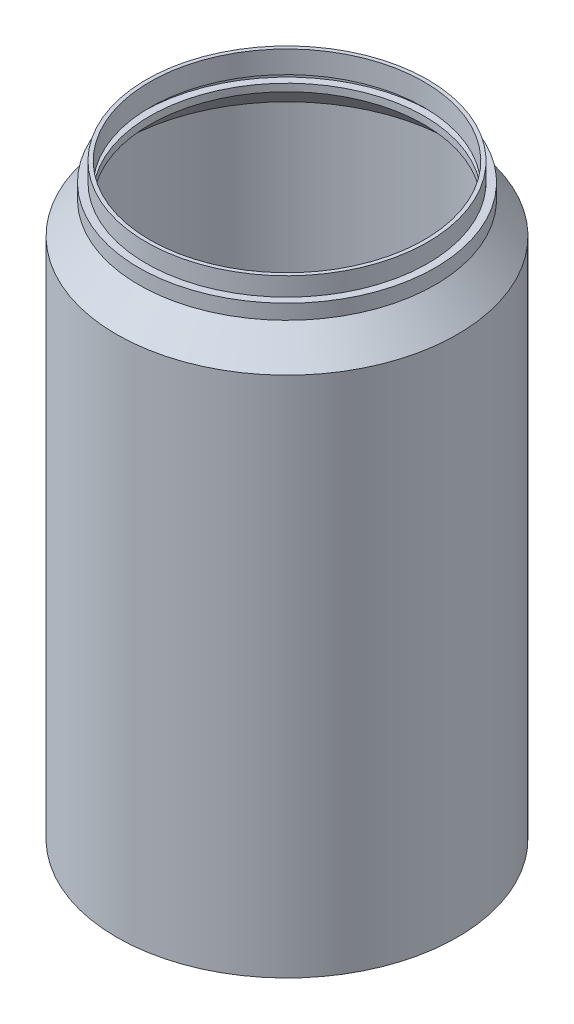
ISO-10303-21;
HEADER;
FILE_DESCRIPTION(('STEP AP214'),'2;1');
FILE_NAME('part.step','',(''),(''),'','','');
FILE_SCHEMA(('AUTOMOTIVE_DESIGN { 1 0 10303 214 1 1 1 1 }'));
ENDSEC;
DATA;
#1=APPLICATION_CONTEXT('core data for automotive mechanical design processes');
#2=APPLICATION_PROTOCOL_DEFINITION('international standard','automotive_design',2000,#1);
#3=PRODUCT_CONTEXT('',#1,'mechanical');
#4=PRODUCT('Part','Part','',(#3));
#5=PRODUCT_RELATED_PRODUCT_CATEGORY('part','',(#4));
#6=PRODUCT_DEFINITION_FORMATION('','',#4);
#7=PRODUCT_DEFINITION_CONTEXT('part definition',#1,'design');
#8=PRODUCT_DEFINITION('design','',#6,#7);
#9=PRODUCT_DEFINITION_SHAPE('','',#8);
#10=(LENGTH_UNIT() NAMED_UNIT(*) SI_UNIT(.MILLI.,.METRE.));
#11=(NAMED_UNIT(*) PLANE_ANGLE_UNIT() SI_UNIT($,.RADIAN.));
#12=(NAMED_UNIT(*) SI_UNIT($,.STERADIAN.) SOLID_ANGLE_UNIT());
#13=UNCERTAINTY_MEASURE_WITH_UNIT(LENGTH_MEASURE(1.E-05),#10,'distance_accuracy_value','');
#14=(GEOMETRIC_REPRESENTATION_CONTEXT(3) GLOBAL_UNCERTAINTY_ASSIGNED_CONTEXT((#13)) GLOBAL_UNIT_ASSIGNED_CONTEXT((#10,
#11,#12)) REPRESENTATION_CONTEXT('',''));
#15=CARTESIAN_POINT('',(0.,0.,0.));
#16=DIRECTION('',(0.,0.,1.));
#17=DIRECTION('',(1.,0.,0.));
#18=AXIS2_PLACEMENT_3D('',#15,#16,#17);
#19=CARTESIAN_POINT('',(-29.,-0.999999999999987,24.2690364233758));
#20=DIRECTION('',(0.,1.,0.));
#21=DIRECTION('',(0.,0.,1.));
#22=AXIS2_PLACEMENT_3D('',#19,#20,#21);
#23=PLANE('',#22);
#24=CARTESIAN_POINT('',(0.,-0.999999999999973,24.2690364233758));
#25=DIRECTION('',(0.,-1.,0.));
#26=DIRECTION('',(0.,0.,-1.));
#27=AXIS2_PLACEMENT_3D('',#24,#25,#26);
#28=CIRCLE('',#27,28.684701211121);
#29=CARTESIAN_POINT('',(0.,-0.999999999999973,-4.41566478774523));
#30=VERTEX_POINT('',#29);
#31=EDGE_CURVE('E10',#30,#30,#28,.T.);
#32=ORIENTED_EDGE('',*,*,#31,.T.);
#33=EDGE_LOOP('',(#32));
#34=FACE_BOUND('',#33,.T.);
#35=ADVANCED_FACE('F29',(#34),#23,.F.);
#36=CARTESIAN_POINT('',(0.,-3.10062261462914,24.2690364233758));
#37=DIRECTION('',(0.,-1.,0.));
#38=DIRECTION('',(0.,0.,-1.));
#39=AXIS2_PLACEMENT_3D('',#36,#37,#38);
#40=CONICAL_SURFACE('',#39,31.684701211121,0.959931088596874);
#41=ORIENTED_EDGE('',*,*,#31,.F.);
#42=EDGE_LOOP('',(#41));
#43=FACE_BOUND('',#42,.T.);
#44=CARTESIAN_POINT('',(0.,-3.10062261462914,24.2690364233758));
#45=DIRECTION('',(0.,-1.,0.));
#46=DIRECTION('',(0.,0.,-1.));
#47=AXIS2_PLACEMENT_3D('',#44,#45,#46);
#48=CIRCLE('',#47,31.684701211121);
#49=CARTESIAN_POINT('',(0.,-3.10062261462914,-7.41566478774523));
#50=VERTEX_POINT('',#49);
#51=EDGE_CURVE('E35',#50,#50,#48,.T.);
#52=ORIENTED_EDGE('',*,*,#51,.T.);
#53=EDGE_LOOP('',(#52));
#54=FACE_BOUND('',#53,.T.);
#55=ADVANCED_FACE('F115',(#43,#54),#40,.F.);
#56=CARTESIAN_POINT('',(-37.,-3.10062261462914,24.2690364233758));
#57=DIRECTION('',(0.,1.,0.));
#58=DIRECTION('',(0.,0.,1.));
#59=AXIS2_PLACEMENT_3D('',#56,#57,#58);
#60=PLANE('',#59);
#61=ORIENTED_EDGE('',*,*,#51,.F.);
#62=EDGE_LOOP('',(#61));
#63=FACE_BOUND('',#62,.T.);
#64=CARTESIAN_POINT('',(0.,-3.10062261462914,24.2690364233758));
#65=DIRECTION('',(0.,-1.,0.));
#66=DIRECTION('',(0.,0.,-1.));
#67=AXIS2_PLACEMENT_3D('',#64,#65,#66);
#68=CIRCLE('',#67,37.315298788879);
#69=CARTESIAN_POINT('',(0.,-3.10062261462914,-13.0462623655032));
#70=VERTEX_POINT('',#69);
#71=EDGE_CURVE('E39',#70,#70,#68,.T.);
#72=ORIENTED_EDGE('',*,*,#71,.T.);
#73=EDGE_LOOP('',(#72));
#74=FACE_BOUND('',#73,.T.);
#75=ADVANCED_FACE('F119',(#63,#74),#60,.F.);
#76=CARTESIAN_POINT('',(0.,2.98047064049682,24.2690364233758));
#77=DIRECTION('',(0.,1.,0.));
#78=DIRECTION('',(0.,0.,1.));
#79=AXIS2_PLACEMENT_3D('',#76,#77,#78);
#80=CONICAL_SURFACE('',#79,46.,0.95993108859688);
#81=ORIENTED_EDGE('',*,*,#71,.F.);
#82=EDGE_LOOP('',(#81));
#83=FACE_BOUND('',#82,.T.);
#84=CARTESIAN_POINT('',(0.,2.98047064049682,24.2690364233758));
#85=DIRECTION('',(0.,-1.,0.));
#86=DIRECTION('',(0.,0.,-1.));
#87=AXIS2_PLACEMENT_3D('',#84,#85,#86);
#88=CIRCLE('',#87,46.);
#89=CARTESIAN_POINT('',(0.,2.98047064049682,-21.7309635766242));
#90=VERTEX_POINT('',#89);
#91=EDGE_CURVE('E43',#90,#90,#88,.T.);
#92=ORIENTED_EDGE('',*,*,#91,.T.);
#93=EDGE_LOOP('',(#92));
#94=FACE_BOUND('',#93,.T.);
#95=ADVANCED_FACE('F124',(#83,#94),#80,.T.);
#96=CARTESIAN_POINT('',(0.,0.,24.2690364233758));
#97=DIRECTION('',(0.,-1.,0.));
#98=DIRECTION('',(0.,0.,-1.));
#99=AXIS2_PLACEMENT_3D('',#96,#97,#98);
#100=CYLINDRICAL_SURFACE('',#99,46.);
#101=ORIENTED_EDGE('',*,*,#91,.F.);
#102=EDGE_LOOP('',(#101));
#103=FACE_BOUND('',#102,.T.);
#104=CARTESIAN_POINT('',(0.,143.915251253422,24.2690364233758));
#105=DIRECTION('',(0.,-1.,0.));
#106=DIRECTION('',(0.,0.,-1.));
#107=AXIS2_PLACEMENT_3D('',#104,#105,#106);
#108=CIRCLE('',#107,46.);
#109=CARTESIAN_POINT('',(0.,143.915251253422,-21.7309635766242));
#110=VERTEX_POINT('',#109);
#111=EDGE_CURVE('E48',#110,#110,#108,.T.);
#112=ORIENTED_EDGE('',*,*,#111,.T.);
#113=EDGE_LOOP('',(#112));
#114=FACE_BOUND('',#113,.T.);
#115=ADVANCED_FACE('F130',(#103,#114),#100,.T.);
#116=CARTESIAN_POINT('',(0.,151.915251253422,24.2690364233758));
#117=DIRECTION('',(0.,-1.,0.));
#118=DIRECTION('',(0.,0.,-1.));
#119=AXIS2_PLACEMENT_3D('',#116,#117,#118);
#120=CONICAL_SURFACE('',#119,38.,0.78539816339745);
#121=ORIENTED_EDGE('',*,*,#111,.F.);
#122=EDGE_LOOP('',(#121));
#123=FACE_BOUND('',#122,.T.);
#124=CARTESIAN_POINT('',(0.,151.915251253422,24.2690364233758));
#125=DIRECTION('',(0.,-1.,0.));
#126=DIRECTION('',(0.,0.,-1.));
#127=AXIS2_PLACEMENT_3D('',#124,#125,#126);
#128=CIRCLE('',#127,38.);
#129=CARTESIAN_POINT('',(0.,151.915251253422,-13.7309635766242));
#130=VERTEX_POINT('',#129);
#131=EDGE_CURVE('E51',#130,#130,#128,.T.);
#132=ORIENTED_EDGE('',*,*,#131,.T.);
#133=EDGE_LOOP('',(#132));
#134=FACE_BOUND('',#133,.T.);
#135=ADVANCED_FACE('F134',(#123,#134),#120,.T.);
#136=CARTESIAN_POINT('',(0.,0.,24.2690364233758));
#137=DIRECTION('',(0.,-1.,0.));
#138=DIRECTION('',(0.,0.,-1.));
#139=AXIS2_PLACEMENT_3D('',#136,#137,#138);
#140=CYLINDRICAL_SURFACE('',#139,38.);
#141=ORIENTED_EDGE('',*,*,#131,.F.);
#142=EDGE_LOOP('',(#141));
#143=FACE_BOUND('',#142,.T.);
#144=CARTESIAN_POINT('',(0.,152.501037691049,24.2690364233758));
#145=DIRECTION('',(0.,-1.,0.));
#146=DIRECTION('',(0.,0.,-1.));
#147=AXIS2_PLACEMENT_3D('',#144,#145,#146);
#148=CIRCLE('',#147,38.);
#149=CARTESIAN_POINT('',(0.,152.501037691049,-13.7309635766242));
#150=VERTEX_POINT('',#149);
#151=EDGE_CURVE('E54',#150,#150,#148,.T.);
#152=ORIENTED_EDGE('',*,*,#151,.T.);
#153=EDGE_LOOP('',(#152));
#154=FACE_BOUND('',#153,.T.);
#155=ADVANCED_FACE('F138',(#143,#154),#140,.T.);
#156=CARTESIAN_POINT('',(-39.,152.501037691049,24.2690364233758));
#157=DIRECTION('',(0.,1.,0.));
#158=DIRECTION('',(0.,0.,1.));
#159=AXIS2_PLACEMENT_3D('',#156,#157,#158);
#160=PLANE('',#159);
#161=ORIENTED_EDGE('',*,*,#151,.F.);
#162=EDGE_LOOP('',(#161));
#163=FACE_BOUND('',#162,.T.);
#164=CARTESIAN_POINT('',(0.,152.501037691049,24.2690364233758));
#165=DIRECTION('',(0.,-1.,0.));
#166=DIRECTION('',(0.,0.,-1.));
#167=AXIS2_PLACEMENT_3D('',#164,#165,#166);
#168=CIRCLE('',#167,40.);
#169=CARTESIAN_POINT('',(0.,152.501037691049,-15.7309635766242));
#170=VERTEX_POINT('',#169);
#171=EDGE_CURVE('E57',#170,#170,#168,.T.);
#172=ORIENTED_EDGE('',*,*,#171,.T.);
#173=EDGE_LOOP('',(#172));
#174=FACE_BOUND('',#173,.T.);
#175=ADVANCED_FACE('F142',(#163,#174),#160,.F.);
#176=CARTESIAN_POINT('',(0.,0.,24.2690364233758));
#177=DIRECTION('',(0.,-1.,0.));
#178=DIRECTION('',(0.,0.,-1.));
#179=AXIS2_PLACEMENT_3D('',#176,#177,#178);
#180=CYLINDRICAL_SURFACE('',#179,40.);
#181=ORIENTED_EDGE('',*,*,#171,.F.);
#182=EDGE_LOOP('',(#181));
#183=FACE_BOUND('',#182,.T.);
#184=CARTESIAN_POINT('',(0.,156.501037691049,24.2690364233758));
#185=DIRECTION('',(0.,-1.,0.));
#186=DIRECTION('',(0.,0.,-1.));
#187=AXIS2_PLACEMENT_3D('',#184,#185,#186);
#188=CIRCLE('',#187,40.);
#189=CARTESIAN_POINT('',(0.,156.501037691049,-15.7309635766242));
#190=VERTEX_POINT('',#189);
#191=EDGE_CURVE('E60',#190,#190,#188,.T.);
#192=ORIENTED_EDGE('',*,*,#191,.T.);
#193=EDGE_LOOP('',(#192));
#194=FACE_BOUND('',#193,.T.);
#195=ADVANCED_FACE('F146',(#183,#194),#180,.T.);
#196=CARTESIAN_POINT('',(-37.,156.501037691049,24.2690364233758));
#197=DIRECTION('',(0.,-1.,0.));
#198=DIRECTION('',(0.,0.,-1.));
#199=AXIS2_PLACEMENT_3D('',#196,#197,#198);
#200=PLANE('',#199);
#201=ORIENTED_EDGE('',*,*,#191,.F.);
#202=EDGE_LOOP('',(#201));
#203=FACE_BOUND('',#202,.T.);
#204=CARTESIAN_POINT('',(0.,156.501037691049,24.2690364233758));
#205=DIRECTION('',(0.,-1.,0.));
#206=DIRECTION('',(0.,0.,-1.));
#207=AXIS2_PLACEMENT_3D('',#204,#205,#206);
#208=CIRCLE('',#207,38.);
#209=CARTESIAN_POINT('',(0.,156.501037691049,-13.7309635766242));
#210=VERTEX_POINT('',#209);
#211=EDGE_CURVE('E63',#210,#210,#208,.T.);
#212=ORIENTED_EDGE('',*,*,#211,.T.);
#213=EDGE_LOOP('',(#212));
#214=FACE_BOUND('',#213,.T.);
#215=ADVANCED_FACE('F150',(#203,#214),#200,.F.);
#216=CARTESIAN_POINT('',(0.,0.,24.2690364233758));
#217=DIRECTION('',(0.,-1.,0.));
#218=DIRECTION('',(0.,0.,-1.));
#219=AXIS2_PLACEMENT_3D('',#216,#217,#218);
#220=CYLINDRICAL_SURFACE('',#219,38.);
#221=ORIENTED_EDGE('',*,*,#211,.F.);
#222=EDGE_LOOP('',(#221));
#223=FACE_BOUND('',#222,.T.);
#224=CARTESIAN_POINT('',(0.,161.501037691049,24.2690364233758));
#225=DIRECTION('',(0.,-1.,0.));
#226=DIRECTION('',(0.,0.,-1.));
#227=AXIS2_PLACEMENT_3D('',#224,#225,#226);
#228=CIRCLE('',#227,38.);
#229=CARTESIAN_POINT('',(0.,161.501037691049,-13.7309635766242));
#230=VERTEX_POINT('',#229);
#231=EDGE_CURVE('E66',#230,#230,#228,.T.);
#232=ORIENTED_EDGE('',*,*,#231,.T.);
#233=EDGE_LOOP('',(#232));
#234=FACE_BOUND('',#233,.T.);
#235=ADVANCED_FACE('F154',(#223,#234),#220,.T.);
#236=CARTESIAN_POINT('',(-38.,161.501037691049,24.2690364233758));
#237=DIRECTION('',(0.,1.,0.));
#238=DIRECTION('',(0.,0.,1.));
#239=AXIS2_PLACEMENT_3D('',#236,#237,#238);
#240=PLANE('',#239);
#241=CARTESIAN_POINT('',(0.,161.501037691049,24.2690364233758));
#242=DIRECTION('',(0.,-1.,0.));
#243=DIRECTION('',(0.,0.,-1.));
#244=AXIS2_PLACEMENT_3D('',#241,#242,#243);
#245=CIRCLE('',#244,37.);
#246=CARTESIAN_POINT('',(0.,161.501037691049,-12.7309635766242));
#247=VERTEX_POINT('',#246);
#248=EDGE_CURVE('E69',#247,#247,#245,.T.);
#249=ORIENTED_EDGE('',*,*,#248,.T.);
#250=EDGE_LOOP('',(#249));
#251=FACE_BOUND('',#250,.T.);
#252=ORIENTED_EDGE('',*,*,#231,.F.);
#253=EDGE_LOOP('',(#252));
#254=FACE_BOUND('',#253,.T.);
#255=ADVANCED_FACE('F158',(#251,#254),#240,.T.);
#256=CARTESIAN_POINT('',(0.,0.,24.2690364233758));
#257=DIRECTION('',(0.,-1.,0.));
#258=DIRECTION('',(0.,0.,-1.));
#259=AXIS2_PLACEMENT_3D('',#256,#257,#258);
#260=CYLINDRICAL_SURFACE('',#259,37.);
#261=CARTESIAN_POINT('',(0.,155.501037691049,24.2690364233758));
#262=DIRECTION('',(0.,-1.,0.));
#263=DIRECTION('',(0.,0.,-1.));
#264=AXIS2_PLACEMENT_3D('',#261,#262,#263);
#265=CIRCLE('',#264,37.);
#266=CARTESIAN_POINT('',(0.,155.501037691049,-12.7309635766242));
#267=VERTEX_POINT('',#266);
#268=EDGE_CURVE('E72',#267,#267,#265,.T.);
#269=ORIENTED_EDGE('',*,*,#268,.T.);
#270=EDGE_LOOP('',(#269));
#271=FACE_BOUND('',#270,.T.);
#272=ORIENTED_EDGE('',*,*,#248,.F.);
#273=EDGE_LOOP('',(#272));
#274=FACE_BOUND('',#273,.T.);
#275=ADVANCED_FACE('F162',(#271,#274),#260,.F.);
#276=CARTESIAN_POINT('',(-37.,155.501037691049,24.2690364233758));
#277=DIRECTION('',(0.,-1.,0.));
#278=DIRECTION('',(0.,0.,-1.));
#279=AXIS2_PLACEMENT_3D('',#276,#277,#278);
#280=PLANE('',#279);
#281=CARTESIAN_POINT('',(0.,155.501037691049,24.2690364233758));
#282=DIRECTION('',(0.,-1.,0.));
#283=DIRECTION('',(0.,0.,-1.));
#284=AXIS2_PLACEMENT_3D('',#281,#282,#283);
#285=CIRCLE('',#284,39.);
#286=CARTESIAN_POINT('',(0.,155.501037691049,-14.7309635766242));
#287=VERTEX_POINT('',#286);
#288=EDGE_CURVE('E75',#287,#287,#285,.T.);
#289=ORIENTED_EDGE('',*,*,#288,.T.);
#290=EDGE_LOOP('',(#289));
#291=FACE_BOUND('',#290,.T.);
#292=ORIENTED_EDGE('',*,*,#268,.F.);
#293=EDGE_LOOP('',(#292));
#294=FACE_BOUND('',#293,.T.);
#295=ADVANCED_FACE('F166',(#291,#294),#280,.T.);
#296=CARTESIAN_POINT('',(0.,0.,24.2690364233758));
#297=DIRECTION('',(0.,-1.,0.));
#298=DIRECTION('',(0.,0.,-1.));
#299=AXIS2_PLACEMENT_3D('',#296,#297,#298);
#300=CYLINDRICAL_SURFACE('',#299,39.);
#301=CARTESIAN_POINT('',(0.,153.501037691049,24.2690364233758));
#302=DIRECTION('',(0.,-1.,0.));
#303=DIRECTION('',(0.,0.,-1.));
#304=AXIS2_PLACEMENT_3D('',#301,#302,#303);
#305=CIRCLE('',#304,39.);
#306=CARTESIAN_POINT('',(0.,153.501037691049,-14.7309635766242));
#307=VERTEX_POINT('',#306);
#308=EDGE_CURVE('E78',#307,#307,#305,.T.);
#309=ORIENTED_EDGE('',*,*,#308,.T.);
#310=EDGE_LOOP('',(#309));
#311=FACE_BOUND('',#310,.T.);
#312=ORIENTED_EDGE('',*,*,#288,.F.);
#313=EDGE_LOOP('',(#312));
#314=FACE_BOUND('',#313,.T.);
#315=ADVANCED_FACE('F170',(#311,#314),#300,.F.);
#316=CARTESIAN_POINT('',(-39.,153.501037691049,24.2690364233758));
#317=DIRECTION('',(0.,1.,0.));
#318=DIRECTION('',(0.,0.,1.));
#319=AXIS2_PLACEMENT_3D('',#316,#317,#318);
#320=PLANE('',#319);
#321=CARTESIAN_POINT('',(0.,153.501037691049,24.2690364233758));
#322=DIRECTION('',(0.,-1.,0.));
#323=DIRECTION('',(0.,0.,-1.));
#324=AXIS2_PLACEMENT_3D('',#321,#322,#323);
#325=CIRCLE('',#324,37.);
#326=CARTESIAN_POINT('',(0.,153.501037691049,-12.7309635766242));
#327=VERTEX_POINT('',#326);
#328=EDGE_CURVE('E81',#327,#327,#325,.T.);
#329=ORIENTED_EDGE('',*,*,#328,.T.);
#330=EDGE_LOOP('',(#329));
#331=FACE_BOUND('',#330,.T.);
#332=ORIENTED_EDGE('',*,*,#308,.F.);
#333=EDGE_LOOP('',(#332));
#334=FACE_BOUND('',#333,.T.);
#335=ADVANCED_FACE('F174',(#331,#334),#320,.T.);
#336=CARTESIAN_POINT('',(0.,0.,24.2690364233758));
#337=DIRECTION('',(0.,-1.,0.));
#338=DIRECTION('',(0.,0.,-1.));
#339=AXIS2_PLACEMENT_3D('',#336,#337,#338);
#340=CYLINDRICAL_SURFACE('',#339,37.);
#341=CARTESIAN_POINT('',(0.,151.501037691049,24.2690364233758));
#342=DIRECTION('',(0.,-1.,0.));
#343=DIRECTION('',(0.,0.,-1.));
#344=AXIS2_PLACEMENT_3D('',#341,#342,#343);
#345=CIRCLE('',#344,37.);
#346=CARTESIAN_POINT('',(0.,151.501037691049,-12.7309635766242));
#347=VERTEX_POINT('',#346);
#348=EDGE_CURVE('E84',#347,#347,#345,.T.);
#349=ORIENTED_EDGE('',*,*,#348,.T.);
#350=EDGE_LOOP('',(#349));
#351=FACE_BOUND('',#350,.T.);
#352=ORIENTED_EDGE('',*,*,#328,.F.);
#353=EDGE_LOOP('',(#352));
#354=FACE_BOUND('',#353,.T.);
#355=ADVANCED_FACE('F178',(#351,#354),#340,.F.);
#356=CARTESIAN_POINT('',(0.,151.501037691049,24.2690364233758));
#357=DIRECTION('',(0.,-1.,0.));
#358=DIRECTION('',(0.,0.,-1.));
#359=AXIS2_PLACEMENT_3D('',#356,#357,#358);
#360=CONICAL_SURFACE('',#359,37.,0.78539816339745);
#361=CARTESIAN_POINT('',(0.,143.501037691049,24.2690364233758));
#362=DIRECTION('',(0.,-1.,0.));
#363=DIRECTION('',(0.,0.,-1.));
#364=AXIS2_PLACEMENT_3D('',#361,#362,#363);
#365=CIRCLE('',#364,45.);
#366=CARTESIAN_POINT('',(0.,143.501037691049,-20.7309635766242));
#367=VERTEX_POINT('',#366);
#368=EDGE_CURVE('E87',#367,#367,#365,.T.);
#369=ORIENTED_EDGE('',*,*,#368,.T.);
#370=EDGE_LOOP('',(#369));
#371=FACE_BOUND('',#370,.T.);
#372=ORIENTED_EDGE('',*,*,#348,.F.);
#373=EDGE_LOOP('',(#372));
#374=FACE_BOUND('',#373,.T.);
#375=ADVANCED_FACE('F182',(#371,#374),#360,.F.);
#376=CARTESIAN_POINT('',(0.,0.,24.2690364233758));
#377=DIRECTION('',(0.,-1.,0.));
#378=DIRECTION('',(0.,0.,-1.));
#379=AXIS2_PLACEMENT_3D('',#376,#377,#378);
#380=CYLINDRICAL_SURFACE('',#379,45.);
#381=CARTESIAN_POINT('',(0.,3.50103769104856,24.2690364233758));
#382=DIRECTION('',(0.,-1.,0.));
#383=DIRECTION('',(0.,0.,-1.));
#384=AXIS2_PLACEMENT_3D('',#381,#382,#383);
#385=CIRCLE('',#384,45.);
#386=CARTESIAN_POINT('',(0.,3.50103769104856,-20.7309635766242));
#387=VERTEX_POINT('',#386);
#388=EDGE_CURVE('E90',#387,#387,#385,.T.);
#389=ORIENTED_EDGE('',*,*,#388,.T.);
#390=EDGE_LOOP('',(#389));
#391=FACE_BOUND('',#390,.T.);
#392=ORIENTED_EDGE('',*,*,#368,.F.);
#393=EDGE_LOOP('',(#392));
#394=FACE_BOUND('',#393,.T.);
#395=ADVANCED_FACE('F186',(#391,#394),#380,.F.);
#396=CARTESIAN_POINT('',(0.,3.50103769104856,24.2690364233758));
#397=DIRECTION('',(0.,1.,0.));
#398=DIRECTION('',(0.,0.,1.));
#399=AXIS2_PLACEMENT_3D('',#396,#397,#398);
#400=CONICAL_SURFACE('',#399,45.,0.95993108859688);
#401=CARTESIAN_POINT('',(0.,-2.10062261462914,24.2690364233758));
#402=DIRECTION('',(0.,-1.,0.));
#403=DIRECTION('',(0.,0.,-1.));
#404=AXIS2_PLACEMENT_3D('',#401,#402,#403);
#405=CIRCLE('',#404,37.);
#406=CARTESIAN_POINT('',(0.,-2.10062261462914,-12.7309635766242));
#407=VERTEX_POINT('',#406);
#408=EDGE_CURVE('E93',#407,#407,#405,.T.);
#409=ORIENTED_EDGE('',*,*,#408,.T.);
#410=EDGE_LOOP('',(#409));
#411=FACE_BOUND('',#410,.T.);
#412=ORIENTED_EDGE('',*,*,#388,.F.);
#413=EDGE_LOOP('',(#412));
#414=FACE_BOUND('',#413,.T.);
#415=ADVANCED_FACE('F190',(#411,#414),#400,.F.);
#416=CARTESIAN_POINT('',(-37.,-2.10062261462914,24.2690364233758));
#417=DIRECTION('',(0.,1.,0.));
#418=DIRECTION('',(0.,0.,1.));
#419=AXIS2_PLACEMENT_3D('',#416,#417,#418);
#420=PLANE('',#419);
#421=CARTESIAN_POINT('',(0.,-2.10062261462914,24.2690364233758));
#422=DIRECTION('',(0.,-1.,0.));
#423=DIRECTION('',(0.,0.,-1.));
#424=AXIS2_PLACEMENT_3D('',#421,#422,#423);
#425=CIRCLE('',#424,32.);
#426=CARTESIAN_POINT('',(0.,-2.10062261462914,-7.73096357662422));
#427=VERTEX_POINT('',#426);
#428=EDGE_CURVE('E96',#427,#427,#425,.T.);
#429=ORIENTED_EDGE('',*,*,#428,.T.);
#430=EDGE_LOOP('',(#429));
#431=FACE_BOUND('',#430,.T.);
#432=ORIENTED_EDGE('',*,*,#408,.F.);
#433=EDGE_LOOP('',(#432));
#434=FACE_BOUND('',#433,.T.);
#435=ADVANCED_FACE('F112',(#431,#434),#420,.T.);
#436=CARTESIAN_POINT('',(0.,-2.10062261462914,24.2690364233758));
#437=DIRECTION('',(0.,-1.,0.));
#438=DIRECTION('',(0.,0.,-1.));
#439=AXIS2_PLACEMENT_3D('',#436,#437,#438);
#440=CONICAL_SURFACE('',#439,32.,0.959931088596874);
#441=CARTESIAN_POINT('',(0.,0.,24.2690364233758));
#442=DIRECTION('',(0.,-1.,0.));
#443=DIRECTION('',(0.,0.,-1.));
#444=AXIS2_PLACEMENT_3D('',#441,#442,#443);
#445=CIRCLE('',#444,29.);
#446=CARTESIAN_POINT('',(0.,0.,-4.73096357662422));
#447=VERTEX_POINT('',#446);
#448=EDGE_CURVE('E99',#447,#447,#445,.T.);
#449=ORIENTED_EDGE('',*,*,#448,.T.);
#450=EDGE_LOOP('',(#449));
#451=FACE_BOUND('',#450,.T.);
#452=ORIENTED_EDGE('',*,*,#428,.F.);
#453=EDGE_LOOP('',(#452));
#454=FACE_BOUND('',#453,.T.);
#455=ADVANCED_FACE('F103',(#451,#454),#440,.T.);
#456=CARTESIAN_POINT('',(-29.,0.,24.2690364233758));
#457=DIRECTION('',(0.,1.,0.));
#458=DIRECTION('',(0.,0.,1.));
#459=AXIS2_PLACEMENT_3D('',#456,#457,#458);
#460=PLANE('',#459);
#461=ORIENTED_EDGE('',*,*,#448,.F.);
#462=EDGE_LOOP('',(#461));
#463=FACE_BOUND('',#462,.T.);
#464=ADVANCED_FACE('F106',(#463),#460,.T.);
#465=CLOSED_SHELL('',(#35,#55,#75,#95,#115,#135,#155,#175,#195,#215,#235,#255,#275,#295,#315,
#335,#355,#375,#395,#415,#435,#455,#464));
#466=MANIFOLD_SOLID_BREP('B2',#465);
#467=ADVANCED_BREP_SHAPE_REPRESENTATION('',(#18,#466),#14);
#468=SHAPE_DEFINITION_REPRESENTATION(#9,#467);
ENDSEC;
END-ISO-10303-21;
